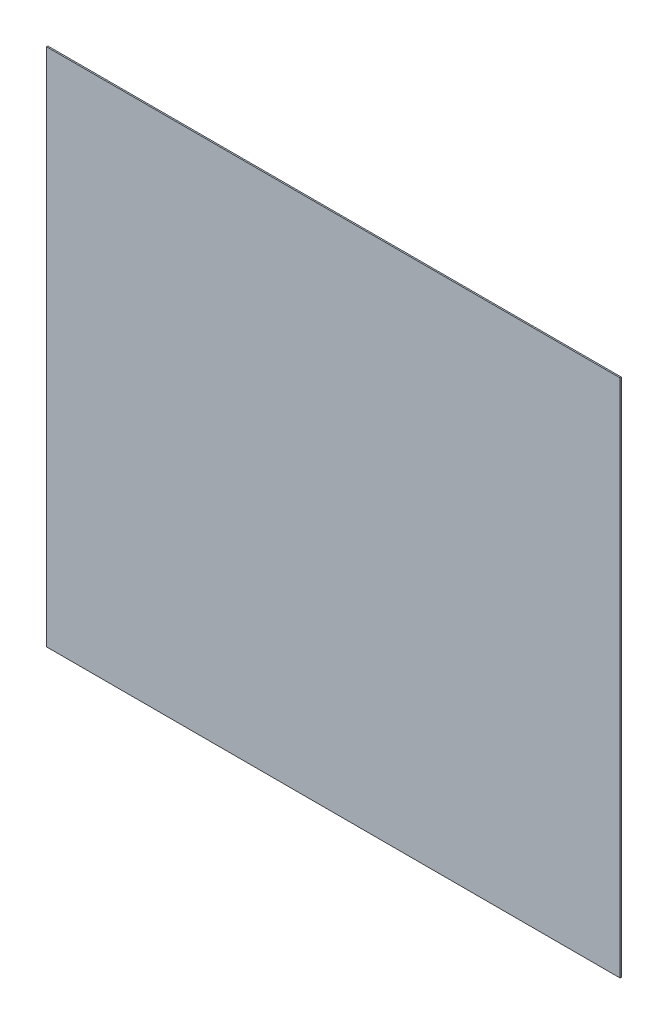
ISO-10303-21;
HEADER;
FILE_DESCRIPTION(('STEP AP214'),'2;1');
FILE_NAME('part.step','',(''),(''),'','','');
FILE_SCHEMA(('AUTOMOTIVE_DESIGN { 1 0 10303 214 1 1 1 1 }'));
ENDSEC;
DATA;
#1=APPLICATION_CONTEXT('core data for automotive mechanical design processes');
#2=APPLICATION_PROTOCOL_DEFINITION('international standard','automotive_design',2000,#1);
#3=PRODUCT_CONTEXT('',#1,'mechanical');
#4=PRODUCT('Part','Part','',(#3));
#5=PRODUCT_RELATED_PRODUCT_CATEGORY('part','',(#4));
#6=PRODUCT_DEFINITION_FORMATION('','',#4);
#7=PRODUCT_DEFINITION_CONTEXT('part definition',#1,'design');
#8=PRODUCT_DEFINITION('design','',#6,#7);
#9=PRODUCT_DEFINITION_SHAPE('','',#8);
#10=(LENGTH_UNIT() NAMED_UNIT(*) SI_UNIT(.MILLI.,.METRE.));
#11=(NAMED_UNIT(*) PLANE_ANGLE_UNIT() SI_UNIT($,.RADIAN.));
#12=(NAMED_UNIT(*) SI_UNIT($,.STERADIAN.) SOLID_ANGLE_UNIT());
#13=UNCERTAINTY_MEASURE_WITH_UNIT(LENGTH_MEASURE(1.E-05),#10,'distance_accuracy_value','');
#14=(GEOMETRIC_REPRESENTATION_CONTEXT(3) GLOBAL_UNCERTAINTY_ASSIGNED_CONTEXT((#13)) GLOBAL_UNIT_ASSIGNED_CONTEXT((#10,
#11,#12)) REPRESENTATION_CONTEXT('',''));
#15=CARTESIAN_POINT('',(0.,0.,0.));
#16=DIRECTION('',(0.,0.,1.));
#17=DIRECTION('',(1.,0.,0.));
#18=AXIS2_PLACEMENT_3D('',#15,#16,#17);
#19=CARTESIAN_POINT('',(30.,120.,40.));
#20=DIRECTION('',(1.,0.,0.));
#21=DIRECTION('',(0.,0.,-1.));
#22=AXIS2_PLACEMENT_3D('',#19,#20,#21);
#23=PLANE('',#22);
#24=DIRECTION('',(0.,-1.,0.));
#25=VECTOR('',#24,1.);
#26=CARTESIAN_POINT('',(30.,120.,38.5));
#27=LINE('',#26,#25);
#28=CARTESIAN_POINT('',(30.,700.,38.5));
#29=VERTEX_POINT('',#28);
#30=CARTESIAN_POINT('',(30.,120.,38.5));
#31=VERTEX_POINT('',#30);
#32=EDGE_CURVE('E102',#29,#31,#27,.T.);
#33=ORIENTED_EDGE('',*,*,#32,.T.);
#34=DIRECTION('',(0.,0.,-1.));
#35=VECTOR('',#34,1.);
#36=CARTESIAN_POINT('',(30.,120.,40.));
#37=LINE('',#36,#35);
#38=CARTESIAN_POINT('',(30.,120.,40.));
#39=VERTEX_POINT('',#38);
#40=EDGE_CURVE('E11',#39,#31,#37,.T.);
#41=ORIENTED_EDGE('',*,*,#40,.F.);
#42=DIRECTION('',(0.,-1.,0.));
#43=VECTOR('',#42,1.);
#44=CARTESIAN_POINT('',(30.,120.,40.));
#45=LINE('',#44,#43);
#46=CARTESIAN_POINT('',(30.,700.,40.));
#47=VERTEX_POINT('',#46);
#48=EDGE_CURVE('E90',#47,#39,#45,.T.);
#49=ORIENTED_EDGE('',*,*,#48,.F.);
#50=DIRECTION('',(0.,0.,-1.));
#51=VECTOR('',#50,1.);
#52=CARTESIAN_POINT('',(30.,700.,40.));
#53=LINE('',#52,#51);
#54=EDGE_CURVE('E98',#47,#29,#53,.T.);
#55=ORIENTED_EDGE('',*,*,#54,.T.);
#56=EDGE_LOOP('',(#33,#41,#49,#55));
#57=FACE_BOUND('',#56,.T.);
#58=ADVANCED_FACE('F39',(#57),#23,.F.);
#59=CARTESIAN_POINT('',(30.,120.,40.));
#60=DIRECTION('',(0.,1.,0.));
#61=DIRECTION('',(0.,0.,1.));
#62=AXIS2_PLACEMENT_3D('',#59,#60,#61);
#63=PLANE('',#62);
#64=DIRECTION('',(1.,0.,0.));
#65=VECTOR('',#64,1.);
#66=CARTESIAN_POINT('',(30.,120.,38.5));
#67=LINE('',#66,#65);
#68=CARTESIAN_POINT('',(670.,120.,38.5));
#69=VERTEX_POINT('',#68);
#70=EDGE_CURVE('E94',#31,#69,#67,.T.);
#71=ORIENTED_EDGE('',*,*,#70,.T.);
#72=DIRECTION('',(0.,0.,-1.));
#73=VECTOR('',#72,1.);
#74=CARTESIAN_POINT('',(670.,120.,40.));
#75=LINE('',#74,#73);
#76=CARTESIAN_POINT('',(670.,120.,40.));
#77=VERTEX_POINT('',#76);
#78=EDGE_CURVE('E47',#77,#69,#75,.T.);
#79=ORIENTED_EDGE('',*,*,#78,.F.);
#80=DIRECTION('',(1.,0.,0.));
#81=VECTOR('',#80,1.);
#82=CARTESIAN_POINT('',(30.,120.,40.));
#83=LINE('',#82,#81);
#84=EDGE_CURVE('E85',#39,#77,#83,.T.);
#85=ORIENTED_EDGE('',*,*,#84,.F.);
#86=ORIENTED_EDGE('',*,*,#40,.T.);
#87=EDGE_LOOP('',(#71,#79,#85,#86));
#88=FACE_BOUND('',#87,.T.);
#89=ADVANCED_FACE('F93',(#88),#63,.F.);
#90=CARTESIAN_POINT('',(670.,120.,40.));
#91=DIRECTION('',(-1.,0.,0.));
#92=DIRECTION('',(0.,0.,1.));
#93=AXIS2_PLACEMENT_3D('',#90,#91,#92);
#94=PLANE('',#93);
#95=DIRECTION('',(0.,1.,0.));
#96=VECTOR('',#95,1.);
#97=CARTESIAN_POINT('',(670.,120.,38.5));
#98=LINE('',#97,#96);
#99=CARTESIAN_POINT('',(670.,700.,38.5));
#100=VERTEX_POINT('',#99);
#101=EDGE_CURVE('E72',#69,#100,#98,.T.);
#102=ORIENTED_EDGE('',*,*,#101,.T.);
#103=DIRECTION('',(0.,0.,-1.));
#104=VECTOR('',#103,1.);
#105=CARTESIAN_POINT('',(670.,700.,40.));
#106=LINE('',#105,#104);
#107=CARTESIAN_POINT('',(670.,700.,40.));
#108=VERTEX_POINT('',#107);
#109=EDGE_CURVE('E95',#108,#100,#106,.T.);
#110=ORIENTED_EDGE('',*,*,#109,.F.);
#111=DIRECTION('',(0.,1.,0.));
#112=VECTOR('',#111,1.);
#113=CARTESIAN_POINT('',(670.,120.,40.));
#114=LINE('',#113,#112);
#115=EDGE_CURVE('E88',#77,#108,#114,.T.);
#116=ORIENTED_EDGE('',*,*,#115,.F.);
#117=ORIENTED_EDGE('',*,*,#78,.T.);
#118=EDGE_LOOP('',(#102,#110,#116,#117));
#119=FACE_BOUND('',#118,.T.);
#120=ADVANCED_FACE('F96',(#119),#94,.F.);
#121=CARTESIAN_POINT('',(30.,700.,40.));
#122=DIRECTION('',(0.,-1.,0.));
#123=DIRECTION('',(0.,0.,-1.));
#124=AXIS2_PLACEMENT_3D('',#121,#122,#123);
#125=PLANE('',#124);
#126=DIRECTION('',(-1.,0.,0.));
#127=VECTOR('',#126,1.);
#128=CARTESIAN_POINT('',(30.,700.,38.5));
#129=LINE('',#128,#127);
#130=EDGE_CURVE('E78',#100,#29,#129,.T.);
#131=ORIENTED_EDGE('',*,*,#130,.T.);
#132=ORIENTED_EDGE('',*,*,#54,.F.);
#133=DIRECTION('',(-1.,0.,0.));
#134=VECTOR('',#133,1.);
#135=CARTESIAN_POINT('',(30.,700.,40.));
#136=LINE('',#135,#134);
#137=EDGE_CURVE('E55',#108,#47,#136,.T.);
#138=ORIENTED_EDGE('',*,*,#137,.F.);
#139=ORIENTED_EDGE('',*,*,#109,.T.);
#140=EDGE_LOOP('',(#131,#132,#138,#139));
#141=FACE_BOUND('',#140,.T.);
#142=ADVANCED_FACE('F109',(#141),#125,.F.);
#143=CARTESIAN_POINT('',(0.,0.,40.));
#144=DIRECTION('',(0.,0.,-1.));
#145=DIRECTION('',(-1.,0.,0.));
#146=AXIS2_PLACEMENT_3D('',#143,#144,#145);
#147=PLANE('',#146);
#148=ORIENTED_EDGE('',*,*,#48,.T.);
#149=ORIENTED_EDGE('',*,*,#84,.T.);
#150=ORIENTED_EDGE('',*,*,#115,.T.);
#151=ORIENTED_EDGE('',*,*,#137,.T.);
#152=EDGE_LOOP('',(#148,#149,#150,#151));
#153=FACE_BOUND('',#152,.T.);
#154=ADVANCED_FACE('F86',(#153),#147,.F.);
#155=CARTESIAN_POINT('',(0.,0.,38.5));
#156=DIRECTION('',(0.,0.,-1.));
#157=DIRECTION('',(-1.,0.,0.));
#158=AXIS2_PLACEMENT_3D('',#155,#156,#157);
#159=PLANE('',#158);
#160=ORIENTED_EDGE('',*,*,#32,.F.);
#161=ORIENTED_EDGE('',*,*,#130,.F.);
#162=ORIENTED_EDGE('',*,*,#101,.F.);
#163=ORIENTED_EDGE('',*,*,#70,.F.);
#164=EDGE_LOOP('',(#160,#161,#162,#163));
#165=FACE_BOUND('',#164,.T.);
#166=ADVANCED_FACE('F112',(#165),#159,.T.);
#167=CLOSED_SHELL('',(#58,#89,#120,#142,#154,#166));
#168=MANIFOLD_SOLID_BREP('B2',#167);
#169=ADVANCED_BREP_SHAPE_REPRESENTATION('',(#18,#168),#14);
#170=SHAPE_DEFINITION_REPRESENTATION(#9,#169);
ENDSEC;
END-ISO-10303-21;
